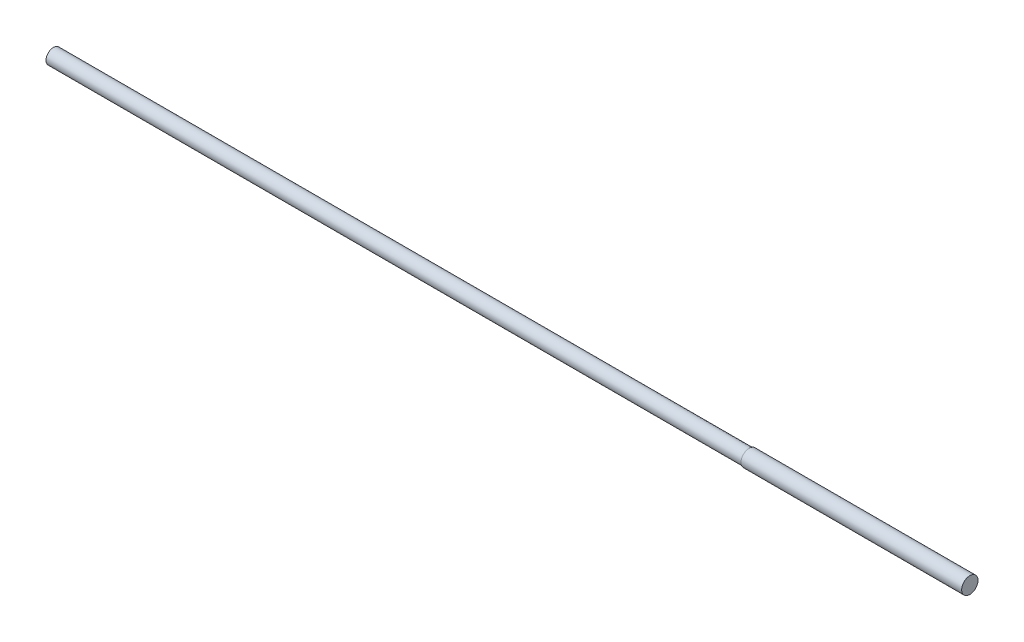
ISO-10303-21;
HEADER;
FILE_DESCRIPTION(('STEP AP214'),'2;1');
FILE_NAME('part.step','',(''),(''),'','','');
FILE_SCHEMA(('AUTOMOTIVE_DESIGN { 1 0 10303 214 1 1 1 1 }'));
ENDSEC;
DATA;
#1=APPLICATION_CONTEXT('core data for automotive mechanical design processes');
#2=APPLICATION_PROTOCOL_DEFINITION('international standard','automotive_design',2000,#1);
#3=PRODUCT_CONTEXT('',#1,'mechanical');
#4=PRODUCT('Part','Part','',(#3));
#5=PRODUCT_RELATED_PRODUCT_CATEGORY('part','',(#4));
#6=PRODUCT_DEFINITION_FORMATION('','',#4);
#7=PRODUCT_DEFINITION_CONTEXT('part definition',#1,'design');
#8=PRODUCT_DEFINITION('design','',#6,#7);
#9=PRODUCT_DEFINITION_SHAPE('','',#8);
#10=(LENGTH_UNIT() NAMED_UNIT(*) SI_UNIT(.MILLI.,.METRE.));
#11=(NAMED_UNIT(*) PLANE_ANGLE_UNIT() SI_UNIT($,.RADIAN.));
#12=(NAMED_UNIT(*) SI_UNIT($,.STERADIAN.) SOLID_ANGLE_UNIT());
#13=UNCERTAINTY_MEASURE_WITH_UNIT(LENGTH_MEASURE(1.E-05),#10,'distance_accuracy_value','');
#14=(GEOMETRIC_REPRESENTATION_CONTEXT(3) GLOBAL_UNCERTAINTY_ASSIGNED_CONTEXT((#13)) GLOBAL_UNIT_ASSIGNED_CONTEXT((#10,
#11,#12)) REPRESENTATION_CONTEXT('',''));
#15=CARTESIAN_POINT('',(0.,0.,0.));
#16=DIRECTION('',(0.,0.,1.));
#17=DIRECTION('',(1.,0.,0.));
#18=AXIS2_PLACEMENT_3D('',#15,#16,#17);
#19=CARTESIAN_POINT('',(103.82,0.,0.));
#20=DIRECTION('',(-1.,0.,0.));
#21=DIRECTION('',(0.,0.,1.));
#22=AXIS2_PLACEMENT_3D('',#19,#20,#21);
#23=CYLINDRICAL_SURFACE('',#22,0.844999999999999);
#24=CARTESIAN_POINT('',(0.,0.,0.));
#25=DIRECTION('',(1.,0.,0.));
#26=DIRECTION('',(0.,0.,-1.));
#27=AXIS2_PLACEMENT_3D('',#24,#25,#26);
#28=CIRCLE('',#27,0.844999999999999);
#29=CARTESIAN_POINT('',(0.,0.,-0.844999999999999));
#30=VERTEX_POINT('',#29);
#31=EDGE_CURVE('E43',#30,#30,#28,.T.);
#32=ORIENTED_EDGE('',*,*,#31,.T.);
#33=EDGE_LOOP('',(#32));
#34=FACE_BOUND('',#33,.T.);
#35=CARTESIAN_POINT('',(78.82,0.,0.));
#36=DIRECTION('',(1.,0.,0.));
#37=DIRECTION('',(0.,0.,-1.));
#38=AXIS2_PLACEMENT_3D('',#35,#36,#37);
#39=CIRCLE('',#38,0.844999999999999);
#40=CARTESIAN_POINT('',(78.82,0.,-0.844999999999999));
#41=VERTEX_POINT('',#40);
#42=EDGE_CURVE('E10',#41,#41,#39,.T.);
#43=ORIENTED_EDGE('',*,*,#42,.F.);
#44=EDGE_LOOP('',(#43));
#45=FACE_BOUND('',#44,.T.);
#46=ADVANCED_FACE('F37',(#34,#45),#23,.T.);
#47=CARTESIAN_POINT('',(0.,0.,0.));
#48=DIRECTION('',(1.,0.,0.));
#49=DIRECTION('',(0.,0.,-1.));
#50=AXIS2_PLACEMENT_3D('',#47,#48,#49);
#51=PLANE('',#50);
#52=ORIENTED_EDGE('',*,*,#31,.F.);
#53=EDGE_LOOP('',(#52));
#54=FACE_BOUND('',#53,.T.);
#55=ADVANCED_FACE('F69',(#54),#51,.F.);
#56=CARTESIAN_POINT('',(78.82,0.,0.));
#57=DIRECTION('',(1.,0.,0.));
#58=DIRECTION('',(0.,0.,-1.));
#59=AXIS2_PLACEMENT_3D('',#56,#57,#58);
#60=PLANE('',#59);
#61=CARTESIAN_POINT('',(78.82,0.,0.));
#62=DIRECTION('',(1.,0.,0.));
#63=DIRECTION('',(0.,0.,-1.));
#64=AXIS2_PLACEMENT_3D('',#61,#62,#63);
#65=CIRCLE('',#64,0.925);
#66=CARTESIAN_POINT('',(78.82,0.,-0.925));
#67=VERTEX_POINT('',#66);
#68=EDGE_CURVE('E47',#67,#67,#65,.T.);
#69=ORIENTED_EDGE('',*,*,#68,.F.);
#70=EDGE_LOOP('',(#69));
#71=FACE_BOUND('',#70,.T.);
#72=ORIENTED_EDGE('',*,*,#42,.T.);
#73=EDGE_LOOP('',(#72));
#74=FACE_BOUND('',#73,.T.);
#75=ADVANCED_FACE('F61',(#71,#74),#60,.F.);
#76=CARTESIAN_POINT('',(78.82,0.,0.));
#77=DIRECTION('',(1.,0.,0.));
#78=DIRECTION('',(0.,0.,-1.));
#79=AXIS2_PLACEMENT_3D('',#76,#77,#78);
#80=CYLINDRICAL_SURFACE('',#79,0.925);
#81=ORIENTED_EDGE('',*,*,#68,.T.);
#82=EDGE_LOOP('',(#81));
#83=FACE_BOUND('',#82,.T.);
#84=CARTESIAN_POINT('',(103.82,0.,0.));
#85=DIRECTION('',(1.,0.,0.));
#86=DIRECTION('',(0.,0.,-1.));
#87=AXIS2_PLACEMENT_3D('',#84,#85,#86);
#88=CIRCLE('',#87,0.925);
#89=CARTESIAN_POINT('',(103.82,0.,-0.925));
#90=VERTEX_POINT('',#89);
#91=EDGE_CURVE('E51',#90,#90,#88,.T.);
#92=ORIENTED_EDGE('',*,*,#91,.F.);
#93=EDGE_LOOP('',(#92));
#94=FACE_BOUND('',#93,.T.);
#95=ADVANCED_FACE('F59',(#83,#94),#80,.T.);
#96=CARTESIAN_POINT('',(103.82,0.,0.));
#97=DIRECTION('',(1.,0.,0.));
#98=DIRECTION('',(0.,0.,-1.));
#99=AXIS2_PLACEMENT_3D('',#96,#97,#98);
#100=PLANE('',#99);
#101=ORIENTED_EDGE('',*,*,#91,.T.);
#102=EDGE_LOOP('',(#101));
#103=FACE_BOUND('',#102,.T.);
#104=ADVANCED_FACE('F57',(#103),#100,.T.);
#105=CLOSED_SHELL('',(#46,#55,#75,#95,#104));
#106=MANIFOLD_SOLID_BREP('B2',#105);
#107=ADVANCED_BREP_SHAPE_REPRESENTATION('',(#18,#106),#14);
#108=SHAPE_DEFINITION_REPRESENTATION(#9,#107);
ENDSEC;
END-ISO-10303-21;
